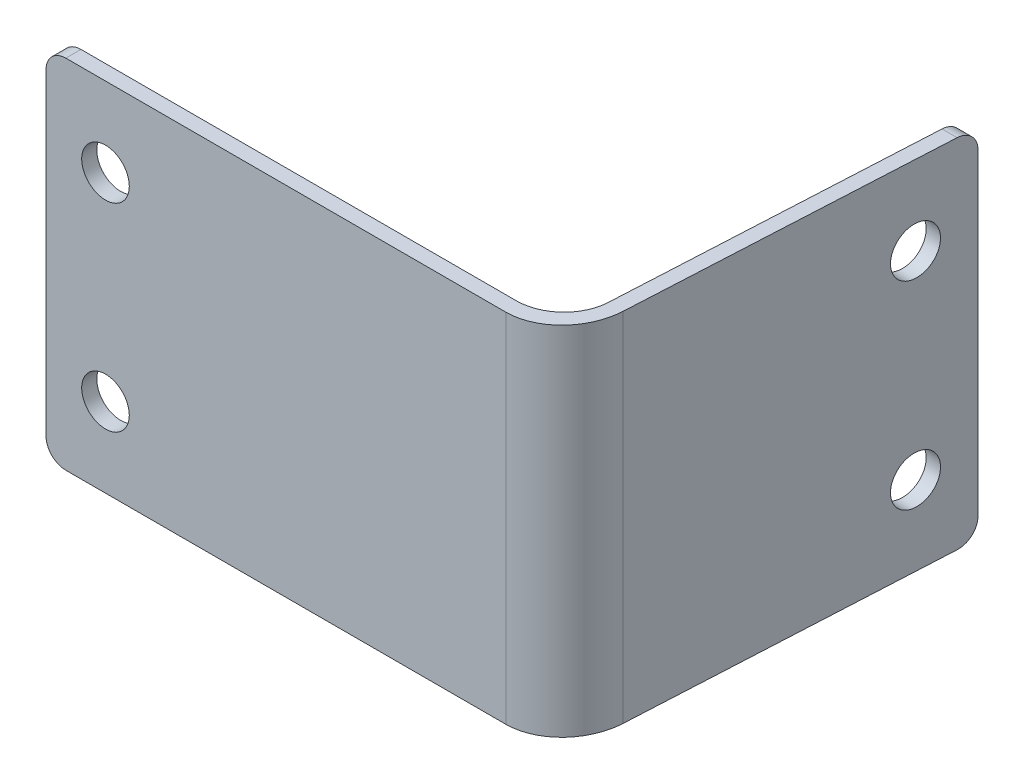
ISO-10303-21;
HEADER;
FILE_DESCRIPTION(('STEP AP214'),'2;1');
FILE_NAME('part.step','',(''),(''),'','','');
FILE_SCHEMA(('AUTOMOTIVE_DESIGN { 1 0 10303 214 1 1 1 1 }'));
ENDSEC;
DATA;
#1=APPLICATION_CONTEXT('core data for automotive mechanical design processes');
#2=APPLICATION_PROTOCOL_DEFINITION('international standard','automotive_design',2000,#1);
#3=PRODUCT_CONTEXT('',#1,'mechanical');
#4=PRODUCT('Part','Part','',(#3));
#5=PRODUCT_RELATED_PRODUCT_CATEGORY('part','',(#4));
#6=PRODUCT_DEFINITION_FORMATION('','',#4);
#7=PRODUCT_DEFINITION_CONTEXT('part definition',#1,'design');
#8=PRODUCT_DEFINITION('design','',#6,#7);
#9=PRODUCT_DEFINITION_SHAPE('','',#8);
#10=(LENGTH_UNIT() NAMED_UNIT(*) SI_UNIT(.MILLI.,.METRE.));
#11=(NAMED_UNIT(*) PLANE_ANGLE_UNIT() SI_UNIT($,.RADIAN.));
#12=(NAMED_UNIT(*) SI_UNIT($,.STERADIAN.) SOLID_ANGLE_UNIT());
#13=UNCERTAINTY_MEASURE_WITH_UNIT(LENGTH_MEASURE(1.E-05),#10,'distance_accuracy_value','');
#14=(GEOMETRIC_REPRESENTATION_CONTEXT(3) GLOBAL_UNCERTAINTY_ASSIGNED_CONTEXT((#13)) GLOBAL_UNIT_ASSIGNED_CONTEXT((#10,
#11,#12)) REPRESENTATION_CONTEXT('',''));
#15=CARTESIAN_POINT('',(0.,0.,0.));
#16=DIRECTION('',(0.,0.,1.));
#17=DIRECTION('',(1.,0.,0.));
#18=AXIS2_PLACEMENT_3D('',#15,#16,#17);
#19=CARTESIAN_POINT('',(155.924923679548,90.,104.096291682077));
#20=DIRECTION('',(0.,1.,0.));
#21=DIRECTION('',(0.,0.,1.));
#22=AXIS2_PLACEMENT_3D('',#19,#20,#21);
#23=ELLIPSE('',#22,15.903708317923,14.644076607642);
#24=DIRECTION('',(0.,-1.,0.));
#25=VECTOR('',#24,1.);
#26=SURFACE_OF_LINEAR_EXTRUSION('',#23,#25);
#27=CARTESIAN_POINT('',(155.924923679548,0.,104.096291682077));
#28=DIRECTION('',(0.,1.,0.));
#29=DIRECTION('',(0.,0.,1.));
#30=AXIS2_PLACEMENT_3D('',#27,#28,#29);
#31=ELLIPSE('',#30,15.903708317923,14.644076607642);
#32=CARTESIAN_POINT('',(155.924923679548,0.,120.));
#33=VERTEX_POINT('',#32);
#34=CARTESIAN_POINT('',(170.545338760942,0.,105.));
#35=VERTEX_POINT('',#34);
#36=EDGE_CURVE('E153',#33,#35,#31,.T.);
#37=ORIENTED_EDGE('',*,*,#36,.T.);
#38=DIRECTION('',(0.,-1.,0.));
#39=VECTOR('',#38,1.);
#40=CARTESIAN_POINT('',(170.545338760942,90.,105.));
#41=LINE('',#40,#39);
#42=CARTESIAN_POINT('',(170.545338760942,90.,105.));
#43=VERTEX_POINT('',#42);
#44=EDGE_CURVE('E132',#43,#35,#41,.T.);
#45=ORIENTED_EDGE('',*,*,#44,.F.);
#46=CARTESIAN_POINT('',(155.924923679548,90.,120.));
#47=VERTEX_POINT('',#46);
#48=EDGE_CURVE('E139',#47,#43,#23,.T.);
#49=ORIENTED_EDGE('',*,*,#48,.F.);
#50=DIRECTION('',(0.,-1.,0.));
#51=VECTOR('',#50,1.);
#52=CARTESIAN_POINT('',(155.924923679548,90.,120.));
#53=LINE('',#52,#51);
#54=EDGE_CURVE('E326',#47,#33,#53,.T.);
#55=ORIENTED_EDGE('',*,*,#54,.T.);
#56=EDGE_LOOP('',(#37,#45,#49,#55));
#57=FACE_BOUND('',#56,.T.);
#58=ADVANCED_FACE('F40',(#57),#26,.F.);
#59=CARTESIAN_POINT('',(175.,90.,20.));
#60=DIRECTION('',(-0.998629534754574,0.,-0.0523359562429405));
#61=DIRECTION('',(-0.0523359562429405,0.,0.998629534754574));
#62=AXIS2_PLACEMENT_3D('',#59,#60,#61);
#63=PLANE('',#62);
#64=CARTESIAN_POINT('',(174.214960656356,70.,34.979443021319));
#65=DIRECTION('',(0.998629534754574,0.,0.0523359562429405));
#66=DIRECTION('',(0.0523359562429405,0.,-0.998629534754574));
#67=AXIS2_PLACEMENT_3D('',#64,#65,#66);
#68=CIRCLE('',#67,6.00000000000001);
#69=CARTESIAN_POINT('',(174.528976393814,70.,28.9876658127916));
#70=VERTEX_POINT('',#69);
#71=EDGE_CURVE('E167',#70,#70,#68,.T.);
#72=ORIENTED_EDGE('',*,*,#71,.F.);
#73=EDGE_LOOP('',(#72));
#74=FACE_BOUND('',#73,.T.);
#75=CARTESIAN_POINT('',(174.214960656356,20.,34.979443021319));
#76=DIRECTION('',(0.998629534754574,0.,0.0523359562429405));
#77=DIRECTION('',(-0.0523359562429405,0.,0.998629534754574));
#78=AXIS2_PLACEMENT_3D('',#75,#76,#77);
#79=CIRCLE('',#78,5.99999999999999);
#80=CARTESIAN_POINT('',(173.900944918898,20.,40.9712202298464));
#81=VERTEX_POINT('',#80);
#82=EDGE_CURVE('E260',#81,#81,#79,.T.);
#83=ORIENTED_EDGE('',*,*,#82,.F.);
#84=EDGE_LOOP('',(#83));
#85=FACE_BOUND('',#84,.T.);
#86=DIRECTION('',(0.0523359562429405,0.,-0.998629534754574));
#87=VECTOR('',#86,1.);
#88=CARTESIAN_POINT('',(175.,0.,20.));
#89=LINE('',#88,#87);
#90=CARTESIAN_POINT('',(174.737961103585,0.,25.));
#91=VERTEX_POINT('',#90);
#92=EDGE_CURVE('E212',#35,#91,#89,.T.);
#93=ORIENTED_EDGE('',*,*,#92,.T.);
#94=CARTESIAN_POINT('',(174.737961103585,5.,25.));
#95=DIRECTION('',(-0.998629534754574,0.,-0.0523359562429405));
#96=DIRECTION('',(0.0523359562429405,0.,-0.998629534754574));
#97=AXIS2_PLACEMENT_3D('',#94,#95,#96);
#98=ELLIPSE('',#97,5.0068617299896,5.);
#99=CARTESIAN_POINT('',(175.,5.00000000000003,20.));
#100=VERTEX_POINT('',#99);
#101=EDGE_CURVE('E12',#91,#100,#98,.F.);
#102=ORIENTED_EDGE('',*,*,#101,.T.);
#103=DIRECTION('',(0.,-1.,0.));
#104=VECTOR('',#103,1.);
#105=CARTESIAN_POINT('',(175.,90.,20.));
#106=LINE('',#105,#104);
#107=CARTESIAN_POINT('',(175.,85.,20.));
#108=VERTEX_POINT('',#107);
#109=EDGE_CURVE('E155',#108,#100,#106,.T.);
#110=ORIENTED_EDGE('',*,*,#109,.F.);
#111=CARTESIAN_POINT('',(174.737961103585,85.,25.));
#112=DIRECTION('',(-0.998629534754574,0.,-0.0523359562429405));
#113=DIRECTION('',(-0.0523359562429405,0.,0.998629534754574));
#114=AXIS2_PLACEMENT_3D('',#111,#112,#113);
#115=ELLIPSE('',#114,5.0068617299896,5.);
#116=CARTESIAN_POINT('',(174.737961103585,90.,25.));
#117=VERTEX_POINT('',#116);
#118=EDGE_CURVE('E48',#108,#117,#115,.F.);
#119=ORIENTED_EDGE('',*,*,#118,.T.);
#120=DIRECTION('',(0.0523359562429405,0.,-0.998629534754574));
#121=VECTOR('',#120,1.);
#122=CARTESIAN_POINT('',(175.,90.,20.));
#123=LINE('',#122,#121);
#124=EDGE_CURVE('E128',#43,#117,#123,.T.);
#125=ORIENTED_EDGE('',*,*,#124,.F.);
#126=ORIENTED_EDGE('',*,*,#44,.T.);
#127=EDGE_LOOP('',(#93,#102,#110,#119,#125,#126));
#128=FACE_BOUND('',#127,.T.);
#129=ADVANCED_FACE('F130',(#74,#85,#128),#63,.F.);
#130=CARTESIAN_POINT('',(171.19,90.,20.));
#131=DIRECTION('',(0.,0.,1.));
#132=DIRECTION('',(1.,0.,0.));
#133=AXIS2_PLACEMENT_3D('',#130,#131,#132);
#134=PLANE('',#133);
#135=ORIENTED_EDGE('',*,*,#109,.T.);
#136=DIRECTION('',(-1.,0.,0.));
#137=VECTOR('',#136,1.);
#138=CARTESIAN_POINT('',(171.19,5.,20.));
#139=LINE('',#138,#137);
#140=CARTESIAN_POINT('',(171.19,5.00000000000003,20.));
#141=VERTEX_POINT('',#140);
#142=EDGE_CURVE('E190',#100,#141,#139,.T.);
#143=ORIENTED_EDGE('',*,*,#142,.T.);
#144=DIRECTION('',(0.,-1.,0.));
#145=VECTOR('',#144,1.);
#146=CARTESIAN_POINT('',(171.19,90.,20.));
#147=LINE('',#146,#145);
#148=CARTESIAN_POINT('',(171.19,85.,20.));
#149=VERTEX_POINT('',#148);
#150=EDGE_CURVE('E159',#149,#141,#147,.T.);
#151=ORIENTED_EDGE('',*,*,#150,.F.);
#152=DIRECTION('',(-1.,0.,0.));
#153=VECTOR('',#152,1.);
#154=CARTESIAN_POINT('',(171.19,85.,20.));
#155=LINE('',#154,#153);
#156=EDGE_CURVE('E60',#149,#108,#155,.F.);
#157=ORIENTED_EDGE('',*,*,#156,.T.);
#158=EDGE_LOOP('',(#135,#143,#151,#157));
#159=FACE_BOUND('',#158,.T.);
#160=ADVANCED_FACE('F215',(#159),#134,.F.);
#161=CARTESIAN_POINT('',(171.19,90.,20.));
#162=DIRECTION('',(0.998629534754574,0.,0.0523359562429405));
#163=DIRECTION('',(0.0523359562429405,0.,-0.998629534754574));
#164=AXIS2_PLACEMENT_3D('',#161,#162,#163);
#165=PLANE('',#164);
#166=CARTESIAN_POINT('',(170.415396445679,70.,34.7803162987941));
#167=DIRECTION('',(0.998629534754574,0.,0.0523359562429405));
#168=DIRECTION('',(0.0523359562429405,0.,-0.998629534754574));
#169=AXIS2_PLACEMENT_3D('',#166,#167,#168);
#170=CIRCLE('',#169,6.00000000000001);
#171=CARTESIAN_POINT('',(170.729412183137,70.,28.7885390902667));
#172=VERTEX_POINT('',#171);
#173=EDGE_CURVE('E166',#172,#172,#170,.T.);
#174=ORIENTED_EDGE('',*,*,#173,.T.);
#175=EDGE_LOOP('',(#174));
#176=FACE_BOUND('',#175,.T.);
#177=CARTESIAN_POINT('',(170.415396445679,20.,34.7803162987941));
#178=DIRECTION('',(0.998629534754574,0.,0.0523359562429405));
#179=DIRECTION('',(0.0523359562429405,0.,-0.998629534754574));
#180=AXIS2_PLACEMENT_3D('',#177,#178,#179);
#181=CIRCLE('',#180,5.99999999999999);
#182=CARTESIAN_POINT('',(170.729412183137,20.,28.7885390902667));
#183=VERTEX_POINT('',#182);
#184=EDGE_CURVE('E163',#183,#183,#181,.T.);
#185=ORIENTED_EDGE('',*,*,#184,.T.);
#186=EDGE_LOOP('',(#185));
#187=FACE_BOUND('',#186,.T.);
#188=ORIENTED_EDGE('',*,*,#150,.T.);
#189=CARTESIAN_POINT('',(170.927961103585,5.,25.));
#190=DIRECTION('',(0.998629534754574,0.,0.0523359562429405));
#191=DIRECTION('',(0.0523359562429405,0.,-0.998629534754574));
#192=AXIS2_PLACEMENT_3D('',#189,#190,#191);
#193=ELLIPSE('',#192,5.0068617299896,5.);
#194=CARTESIAN_POINT('',(170.927961103585,0.,25.));
#195=VERTEX_POINT('',#194);
#196=EDGE_CURVE('E195',#141,#195,#193,.F.);
#197=ORIENTED_EDGE('',*,*,#196,.T.);
#198=DIRECTION('',(-0.0523359562429405,0.,0.998629534754574));
#199=VECTOR('',#198,1.);
#200=CARTESIAN_POINT('',(171.19,0.,20.));
#201=LINE('',#200,#199);
#202=CARTESIAN_POINT('',(166.735338760942,0.,105.));
#203=VERTEX_POINT('',#202);
#204=EDGE_CURVE('E201',#195,#203,#201,.T.);
#205=ORIENTED_EDGE('',*,*,#204,.T.);
#206=DIRECTION('',(0.,-1.,0.));
#207=VECTOR('',#206,1.);
#208=CARTESIAN_POINT('',(166.735338760942,90.,105.));
#209=LINE('',#208,#207);
#210=CARTESIAN_POINT('',(166.735338760942,90.,105.));
#211=VERTEX_POINT('',#210);
#212=EDGE_CURVE('E218',#211,#203,#209,.T.);
#213=ORIENTED_EDGE('',*,*,#212,.F.);
#214=DIRECTION('',(-0.0523359562429405,0.,0.998629534754574));
#215=VECTOR('',#214,1.);
#216=CARTESIAN_POINT('',(171.19,90.,20.));
#217=LINE('',#216,#215);
#218=CARTESIAN_POINT('',(170.927961103585,90.,25.));
#219=VERTEX_POINT('',#218);
#220=EDGE_CURVE('E138',#219,#211,#217,.T.);
#221=ORIENTED_EDGE('',*,*,#220,.F.);
#222=CARTESIAN_POINT('',(170.927961103585,85.,25.));
#223=DIRECTION('',(0.998629534754574,0.,0.0523359562429405));
#224=DIRECTION('',(-0.0523359562429405,0.,0.998629534754574));
#225=AXIS2_PLACEMENT_3D('',#222,#223,#224);
#226=ELLIPSE('',#225,5.0068617299896,5.);
#227=EDGE_CURVE('E193',#219,#149,#226,.F.);
#228=ORIENTED_EDGE('',*,*,#227,.T.);
#229=EDGE_LOOP('',(#188,#197,#205,#213,#221,#228));
#230=FACE_BOUND('',#229,.T.);
#231=ADVANCED_FACE('F199',(#176,#187,#230),#165,.F.);
#232=CARTESIAN_POINT('',(154.751233709055,90.,104.393010375527));
#233=DIRECTION('',(0.,-1.,0.));
#234=DIRECTION('',(-1.,0.,0.));
#235=AXIS2_PLACEMENT_3D('',#232,#233,#234);
#236=ELLIPSE('',#235,12.,11.7969896244727);
#237=DIRECTION('',(0.,-1.,0.));
#238=VECTOR('',#237,1.);
#239=SURFACE_OF_LINEAR_EXTRUSION('',#236,#238);
#240=CARTESIAN_POINT('',(154.751233709055,0.,104.393010375527));
#241=DIRECTION('',(0.,-1.,0.));
#242=DIRECTION('',(-1.,0.,0.));
#243=AXIS2_PLACEMENT_3D('',#240,#241,#242);
#244=ELLIPSE('',#243,12.,11.7969896244727);
#245=CARTESIAN_POINT('',(154.751233709055,0.,116.19));
#246=VERTEX_POINT('',#245);
#247=EDGE_CURVE('E211',#203,#246,#244,.T.);
#248=ORIENTED_EDGE('',*,*,#247,.T.);
#249=DIRECTION('',(0.,-1.,0.));
#250=VECTOR('',#249,1.);
#251=CARTESIAN_POINT('',(154.751233709055,90.,116.19));
#252=LINE('',#251,#250);
#253=CARTESIAN_POINT('',(154.751233709055,90.,116.19));
#254=VERTEX_POINT('',#253);
#255=EDGE_CURVE('E313',#254,#246,#252,.T.);
#256=ORIENTED_EDGE('',*,*,#255,.F.);
#257=EDGE_CURVE('E220',#211,#254,#236,.T.);
#258=ORIENTED_EDGE('',*,*,#257,.F.);
#259=ORIENTED_EDGE('',*,*,#212,.T.);
#260=EDGE_LOOP('',(#248,#256,#258,#259));
#261=FACE_BOUND('',#260,.T.);
#262=ADVANCED_FACE('F228',(#261),#239,.F.);
#263=CARTESIAN_POINT('',(154.751233709055,90.,116.19));
#264=DIRECTION('',(0.,0.,1.));
#265=DIRECTION('',(1.,0.,0.));
#266=AXIS2_PLACEMENT_3D('',#263,#264,#265);
#267=PLANE('',#266);
#268=CARTESIAN_POINT('',(55.,70.,116.19));
#269=DIRECTION('',(0.,0.,1.));
#270=DIRECTION('',(1.,0.,0.));
#271=AXIS2_PLACEMENT_3D('',#268,#269,#270);
#272=CIRCLE('',#271,6.00000000000001);
#273=CARTESIAN_POINT('',(61.,70.,116.19));
#274=VERTEX_POINT('',#273);
#275=EDGE_CURVE('E249',#274,#274,#272,.T.);
#276=ORIENTED_EDGE('',*,*,#275,.T.);
#277=EDGE_LOOP('',(#276));
#278=FACE_BOUND('',#277,.T.);
#279=CARTESIAN_POINT('',(55.,20.,116.19));
#280=DIRECTION('',(0.,0.,1.));
#281=DIRECTION('',(1.,0.,0.));
#282=AXIS2_PLACEMENT_3D('',#279,#280,#281);
#283=CIRCLE('',#282,6.);
#284=CARTESIAN_POINT('',(61.,20.,116.19));
#285=VERTEX_POINT('',#284);
#286=EDGE_CURVE('E252',#285,#285,#283,.T.);
#287=ORIENTED_EDGE('',*,*,#286,.T.);
#288=EDGE_LOOP('',(#287));
#289=FACE_BOUND('',#288,.T.);
#290=DIRECTION('',(-1.,0.,0.));
#291=VECTOR('',#290,1.);
#292=CARTESIAN_POINT('',(154.751233709055,0.,116.19));
#293=LINE('',#292,#291);
#294=CARTESIAN_POINT('',(45.,0.,116.19));
#295=VERTEX_POINT('',#294);
#296=EDGE_CURVE('E321',#246,#295,#293,.T.);
#297=ORIENTED_EDGE('',*,*,#296,.T.);
#298=CARTESIAN_POINT('',(45.,5.,116.19));
#299=DIRECTION('',(0.,0.,1.));
#300=DIRECTION('',(1.,0.,0.));
#301=AXIS2_PLACEMENT_3D('',#298,#299,#300);
#302=CIRCLE('',#301,5.);
#303=CARTESIAN_POINT('',(40.,5.00000000000003,116.19));
#304=VERTEX_POINT('',#303);
#305=EDGE_CURVE('E183',#295,#304,#302,.F.);
#306=ORIENTED_EDGE('',*,*,#305,.T.);
#307=DIRECTION('',(0.,-1.,0.));
#308=VECTOR('',#307,1.);
#309=CARTESIAN_POINT('',(40.,90.,116.19));
#310=LINE('',#309,#308);
#311=CARTESIAN_POINT('',(40.,85.,116.19));
#312=VERTEX_POINT('',#311);
#313=EDGE_CURVE('E306',#312,#304,#310,.T.);
#314=ORIENTED_EDGE('',*,*,#313,.F.);
#315=CARTESIAN_POINT('',(45.,85.,116.19));
#316=DIRECTION('',(0.,0.,1.));
#317=DIRECTION('',(1.,0.,0.));
#318=AXIS2_PLACEMENT_3D('',#315,#316,#317);
#319=CIRCLE('',#318,5.);
#320=CARTESIAN_POINT('',(45.,90.,116.19));
#321=VERTEX_POINT('',#320);
#322=EDGE_CURVE('E181',#312,#321,#319,.F.);
#323=ORIENTED_EDGE('',*,*,#322,.T.);
#324=DIRECTION('',(-1.,0.,0.));
#325=VECTOR('',#324,1.);
#326=CARTESIAN_POINT('',(154.751233709055,90.,116.19));
#327=LINE('',#326,#325);
#328=EDGE_CURVE('E222',#254,#321,#327,.T.);
#329=ORIENTED_EDGE('',*,*,#328,.F.);
#330=ORIENTED_EDGE('',*,*,#255,.T.);
#331=EDGE_LOOP('',(#297,#306,#314,#323,#329,#330));
#332=FACE_BOUND('',#331,.T.);
#333=ADVANCED_FACE('F232',(#278,#289,#332),#267,.F.);
#334=CARTESIAN_POINT('',(40.,90.,116.19));
#335=DIRECTION('',(1.,0.,0.));
#336=DIRECTION('',(0.,0.,-1.));
#337=AXIS2_PLACEMENT_3D('',#334,#335,#336);
#338=PLANE('',#337);
#339=ORIENTED_EDGE('',*,*,#313,.T.);
#340=DIRECTION('',(0.,0.,1.));
#341=VECTOR('',#340,1.);
#342=CARTESIAN_POINT('',(40.,5.,120.));
#343=LINE('',#342,#341);
#344=CARTESIAN_POINT('',(40.,5.00000000000003,120.));
#345=VERTEX_POINT('',#344);
#346=EDGE_CURVE('E157',#304,#345,#343,.T.);
#347=ORIENTED_EDGE('',*,*,#346,.T.);
#348=DIRECTION('',(0.,-1.,0.));
#349=VECTOR('',#348,1.);
#350=CARTESIAN_POINT('',(40.,90.,120.));
#351=LINE('',#350,#349);
#352=CARTESIAN_POINT('',(40.,85.,120.));
#353=VERTEX_POINT('',#352);
#354=EDGE_CURVE('E314',#353,#345,#351,.T.);
#355=ORIENTED_EDGE('',*,*,#354,.F.);
#356=DIRECTION('',(0.,0.,1.));
#357=VECTOR('',#356,1.);
#358=CARTESIAN_POINT('',(40.,85.,116.19));
#359=LINE('',#358,#357);
#360=EDGE_CURVE('E154',#353,#312,#359,.F.);
#361=ORIENTED_EDGE('',*,*,#360,.T.);
#362=EDGE_LOOP('',(#339,#347,#355,#361));
#363=FACE_BOUND('',#362,.T.);
#364=ADVANCED_FACE('F296',(#363),#338,.F.);
#365=CARTESIAN_POINT('',(155.924923679548,90.,120.));
#366=DIRECTION('',(0.,0.,-1.));
#367=DIRECTION('',(-1.,0.,0.));
#368=AXIS2_PLACEMENT_3D('',#365,#366,#367);
#369=PLANE('',#368);
#370=CARTESIAN_POINT('',(55.,70.,120.));
#371=DIRECTION('',(0.,0.,1.));
#372=DIRECTION('',(1.,0.,0.));
#373=AXIS2_PLACEMENT_3D('',#370,#371,#372);
#374=CIRCLE('',#373,6.00000000000001);
#375=CARTESIAN_POINT('',(61.,70.,120.));
#376=VERTEX_POINT('',#375);
#377=EDGE_CURVE('E255',#376,#376,#374,.T.);
#378=ORIENTED_EDGE('',*,*,#377,.F.);
#379=EDGE_LOOP('',(#378));
#380=FACE_BOUND('',#379,.T.);
#381=CARTESIAN_POINT('',(55.,20.,120.));
#382=DIRECTION('',(0.,0.,1.));
#383=DIRECTION('',(-1.,0.,0.));
#384=AXIS2_PLACEMENT_3D('',#381,#382,#383);
#385=CIRCLE('',#384,6.);
#386=CARTESIAN_POINT('',(61.,20.,120.));
#387=VERTEX_POINT('',#386);
#388=EDGE_CURVE('E169',#387,#387,#385,.T.);
#389=ORIENTED_EDGE('',*,*,#388,.F.);
#390=EDGE_LOOP('',(#389));
#391=FACE_BOUND('',#390,.T.);
#392=ORIENTED_EDGE('',*,*,#354,.T.);
#393=CARTESIAN_POINT('',(45.,5.,120.));
#394=DIRECTION('',(0.,0.,-1.));
#395=DIRECTION('',(-1.,0.,0.));
#396=AXIS2_PLACEMENT_3D('',#393,#394,#395);
#397=CIRCLE('',#396,5.);
#398=CARTESIAN_POINT('',(45.,0.,120.));
#399=VERTEX_POINT('',#398);
#400=EDGE_CURVE('E175',#345,#399,#397,.F.);
#401=ORIENTED_EDGE('',*,*,#400,.T.);
#402=DIRECTION('',(1.,0.,0.));
#403=VECTOR('',#402,1.);
#404=CARTESIAN_POINT('',(155.924923679548,0.,120.));
#405=LINE('',#404,#403);
#406=EDGE_CURVE('E150',#399,#33,#405,.T.);
#407=ORIENTED_EDGE('',*,*,#406,.T.);
#408=ORIENTED_EDGE('',*,*,#54,.F.);
#409=DIRECTION('',(1.,0.,0.));
#410=VECTOR('',#409,1.);
#411=CARTESIAN_POINT('',(155.924923679548,90.,120.));
#412=LINE('',#411,#410);
#413=CARTESIAN_POINT('',(45.,90.,120.));
#414=VERTEX_POINT('',#413);
#415=EDGE_CURVE('E146',#414,#47,#412,.T.);
#416=ORIENTED_EDGE('',*,*,#415,.F.);
#417=CARTESIAN_POINT('',(45.,85.,120.));
#418=DIRECTION('',(0.,0.,-1.));
#419=DIRECTION('',(-1.,0.,0.));
#420=AXIS2_PLACEMENT_3D('',#417,#418,#419);
#421=CIRCLE('',#420,5.);
#422=EDGE_CURVE('E173',#414,#353,#421,.F.);
#423=ORIENTED_EDGE('',*,*,#422,.T.);
#424=EDGE_LOOP('',(#392,#401,#407,#408,#416,#423));
#425=FACE_BOUND('',#424,.T.);
#426=ADVANCED_FACE('F292',(#380,#391,#425),#369,.F.);
#427=CARTESIAN_POINT('',(155.924923679548,90.,104.096291682077));
#428=DIRECTION('',(0.,-1.,0.));
#429=DIRECTION('',(0.,0.,-1.));
#430=AXIS2_PLACEMENT_3D('',#427,#428,#429);
#431=PLANE('',#430);
#432=ORIENTED_EDGE('',*,*,#328,.T.);
#433=DIRECTION('',(0.,0.,1.));
#434=VECTOR('',#433,1.);
#435=CARTESIAN_POINT('',(45.,90.,104.096291682077));
#436=LINE('',#435,#434);
#437=EDGE_CURVE('E186',#321,#414,#436,.T.);
#438=ORIENTED_EDGE('',*,*,#437,.T.);
#439=ORIENTED_EDGE('',*,*,#415,.T.);
#440=ORIENTED_EDGE('',*,*,#48,.T.);
#441=ORIENTED_EDGE('',*,*,#124,.T.);
#442=DIRECTION('',(-1.,0.,0.));
#443=VECTOR('',#442,1.);
#444=CARTESIAN_POINT('',(155.924923679548,90.,25.));
#445=LINE('',#444,#443);
#446=EDGE_CURVE('E185',#117,#219,#445,.T.);
#447=ORIENTED_EDGE('',*,*,#446,.T.);
#448=ORIENTED_EDGE('',*,*,#220,.T.);
#449=ORIENTED_EDGE('',*,*,#257,.T.);
#450=EDGE_LOOP('',(#432,#438,#439,#440,#441,#447,#448,#449));
#451=FACE_BOUND('',#450,.T.);
#452=ADVANCED_FACE('F143',(#451),#431,.F.);
#453=CARTESIAN_POINT('',(155.924923679548,0.,104.096291682077));
#454=DIRECTION('',(0.,-1.,0.));
#455=DIRECTION('',(0.,0.,-1.));
#456=AXIS2_PLACEMENT_3D('',#453,#454,#455);
#457=PLANE('',#456);
#458=ORIENTED_EDGE('',*,*,#406,.F.);
#459=DIRECTION('',(0.,0.,1.));
#460=VECTOR('',#459,1.);
#461=CARTESIAN_POINT('',(45.,0.,116.19));
#462=LINE('',#461,#460);
#463=EDGE_CURVE('E179',#399,#295,#462,.F.);
#464=ORIENTED_EDGE('',*,*,#463,.T.);
#465=ORIENTED_EDGE('',*,*,#296,.F.);
#466=ORIENTED_EDGE('',*,*,#247,.F.);
#467=ORIENTED_EDGE('',*,*,#204,.F.);
#468=DIRECTION('',(-1.,0.,0.));
#469=VECTOR('',#468,1.);
#470=CARTESIAN_POINT('',(175.,0.,25.));
#471=LINE('',#470,#469);
#472=EDGE_CURVE('E177',#195,#91,#471,.F.);
#473=ORIENTED_EDGE('',*,*,#472,.T.);
#474=ORIENTED_EDGE('',*,*,#92,.F.);
#475=ORIENTED_EDGE('',*,*,#36,.F.);
#476=EDGE_LOOP('',(#458,#464,#465,#466,#467,#473,#474,#475));
#477=FACE_BOUND('',#476,.T.);
#478=ADVANCED_FACE('F209',(#477),#457,.T.);
#479=CARTESIAN_POINT('',(55.,20.,20.));
#480=DIRECTION('',(0.,0.,1.));
#481=DIRECTION('',(1.,0.,0.));
#482=AXIS2_PLACEMENT_3D('',#479,#480,#481);
#483=CYLINDRICAL_SURFACE('',#482,6.);
#484=CARTESIAN_POINT('',(61.,20.,120.));
#485=CARTESIAN_POINT('',(61.,20.,119.9603125));
#486=CARTESIAN_POINT('',(61.,20.,119.920625));
#487=CARTESIAN_POINT('',(61.,20.,119.84125));
#488=CARTESIAN_POINT('',(61.,20.,119.8015625));
#489=CARTESIAN_POINT('',(61.,20.,119.7221875));
#490=CARTESIAN_POINT('',(61.,20.,119.6825));
#491=CARTESIAN_POINT('',(61.,20.,119.603125));
#492=CARTESIAN_POINT('',(61.,20.,119.5634375));
#493=CARTESIAN_POINT('',(61.,20.,119.4840625));
#494=CARTESIAN_POINT('',(61.,20.,119.444375));
#495=CARTESIAN_POINT('',(61.,20.,119.365));
#496=CARTESIAN_POINT('',(61.,20.,119.3253125));
#497=CARTESIAN_POINT('',(61.,20.,119.2459375));
#498=CARTESIAN_POINT('',(61.,20.,119.20625));
#499=CARTESIAN_POINT('',(61.,20.,119.126875));
#500=CARTESIAN_POINT('',(61.,20.,119.0871875));
#501=CARTESIAN_POINT('',(61.,20.,119.0078125));
#502=CARTESIAN_POINT('',(61.,20.,118.968125));
#503=CARTESIAN_POINT('',(61.,20.,118.88875));
#504=CARTESIAN_POINT('',(61.,20.,118.8490625));
#505=CARTESIAN_POINT('',(61.,20.,118.7696875));
#506=CARTESIAN_POINT('',(61.,20.,118.73));
#507=CARTESIAN_POINT('',(61.,20.,118.650625));
#508=CARTESIAN_POINT('',(61.,20.,118.6109375));
#509=CARTESIAN_POINT('',(61.,20.,118.5315625));
#510=CARTESIAN_POINT('',(61.,20.,118.491875));
#511=CARTESIAN_POINT('',(61.,20.,118.4125));
#512=CARTESIAN_POINT('',(61.,20.,118.3728125));
#513=CARTESIAN_POINT('',(61.,20.,118.2934375));
#514=CARTESIAN_POINT('',(61.,20.,118.25375));
#515=CARTESIAN_POINT('',(61.,20.,118.174375));
#516=CARTESIAN_POINT('',(61.,20.,118.1346875));
#517=CARTESIAN_POINT('',(61.,20.,118.0553125));
#518=CARTESIAN_POINT('',(61.,20.,118.015625));
#519=CARTESIAN_POINT('',(61.,20.,117.93625));
#520=CARTESIAN_POINT('',(61.,20.,117.8965625));
#521=CARTESIAN_POINT('',(61.,20.,117.8171875));
#522=CARTESIAN_POINT('',(61.,20.,117.7775));
#523=CARTESIAN_POINT('',(61.,20.,117.698125));
#524=CARTESIAN_POINT('',(61.,20.,117.6584375));
#525=CARTESIAN_POINT('',(61.,20.,117.5790625));
#526=CARTESIAN_POINT('',(61.,20.,117.539375));
#527=CARTESIAN_POINT('',(61.,20.,117.46));
#528=CARTESIAN_POINT('',(61.,20.,117.4203125));
#529=CARTESIAN_POINT('',(61.,20.,117.3409375));
#530=CARTESIAN_POINT('',(61.,20.,117.30125));
#531=CARTESIAN_POINT('',(61.,20.,117.221875));
#532=CARTESIAN_POINT('',(61.,20.,117.1821875));
#533=CARTESIAN_POINT('',(61.,20.,117.1028125));
#534=CARTESIAN_POINT('',(61.,20.,117.063125));
#535=CARTESIAN_POINT('',(61.,20.,116.98375));
#536=CARTESIAN_POINT('',(61.,20.,116.9440625));
#537=CARTESIAN_POINT('',(61.,20.,116.8646875));
#538=CARTESIAN_POINT('',(61.,20.,116.825));
#539=CARTESIAN_POINT('',(61.,20.,116.745625));
#540=CARTESIAN_POINT('',(61.,20.,116.7059375));
#541=CARTESIAN_POINT('',(61.,20.,116.6265625));
#542=CARTESIAN_POINT('',(61.,20.,116.586875));
#543=CARTESIAN_POINT('',(61.,20.,116.5075));
#544=CARTESIAN_POINT('',(61.,20.,116.4678125));
#545=CARTESIAN_POINT('',(61.,20.,116.3884375));
#546=CARTESIAN_POINT('',(61.,20.,116.34875));
#547=CARTESIAN_POINT('',(61.,20.,116.269375));
#548=CARTESIAN_POINT('',(61.,20.,116.2296875));
#549=CARTESIAN_POINT('',(61.,20.,116.19));
#550=B_SPLINE_CURVE_WITH_KNOTS('',3,(#484,#485,#486,#487,#488,#489,#490,#491,#492,#493,#494,
#495,#496,#497,#498,#499,#500,#501,#502,#503,#504,#505,#506,#507,#508,#509,#510,#511,#512,#513,
#514,#515,#516,#517,#518,#519,#520,#521,#522,#523,#524,#525,#526,#527,#528,#529,#530,#531,#532,
#533,#534,#535,#536,#537,#538,#539,#540,#541,#542,#543,#544,#545,#546,#547,#548,#549),
.UNSPECIFIED.,.F.,.F.,(4,2,2,2,2,2,2,2,2,2,2,2,2,2,2,2,2,2,2,2,2,2,2,2,2,2,2,2,2,2,2,2,4),(0.,
0.119062500000003,0.238125000000006,0.357187499999995,0.476249999999998,0.5953125,
0.714375000000003,0.833437500000006,0.952499999999995,1.0715625,1.190625,1.3096875,
1.42875000000001,1.54781250000001,1.666875,1.7859375,1.905,2.02406250000001,2.14312500000001,
2.2621875,2.38125,2.5003125,2.61937500000001,2.73843750000001,2.85750000000001,2.9765625,
3.095625,3.21468750000001,3.33375000000001,3.45281250000001,3.571875,3.6909375,
3.81000000000001),.UNSPECIFIED.);
#551=EDGE_CURVE('BSEAM283',#387,#285,#550,.T.);
#552=ORIENTED_EDGE('',*,*,#388,.T.);
#553=ORIENTED_EDGE('',*,*,#286,.F.);
#554=ORIENTED_EDGE('',*,*,#551,.T.);
#555=ORIENTED_EDGE('',*,*,#551,.F.);
#556=EDGE_LOOP('',(#552,#554,#553,#555));
#557=FACE_BOUND('',#556,.T.);
#558=ADVANCED_FACE('F283',(#557),#483,.F.);
#559=CARTESIAN_POINT('',(55.,70.,20.));
#560=DIRECTION('',(0.,0.,1.));
#561=DIRECTION('',(1.,0.,0.));
#562=AXIS2_PLACEMENT_3D('',#559,#560,#561);
#563=CYLINDRICAL_SURFACE('',#562,6.00000000000001);
#564=CARTESIAN_POINT('',(61.,70.,120.));
#565=CARTESIAN_POINT('',(61.,70.,119.9603125));
#566=CARTESIAN_POINT('',(61.,70.,119.920625));
#567=CARTESIAN_POINT('',(61.,70.,119.84125));
#568=CARTESIAN_POINT('',(61.,70.,119.8015625));
#569=CARTESIAN_POINT('',(61.,70.,119.7221875));
#570=CARTESIAN_POINT('',(61.,70.,119.6825));
#571=CARTESIAN_POINT('',(61.,70.,119.603125));
#572=CARTESIAN_POINT('',(61.,70.,119.5634375));
#573=CARTESIAN_POINT('',(61.,70.,119.4840625));
#574=CARTESIAN_POINT('',(61.,70.,119.444375));
#575=CARTESIAN_POINT('',(61.,70.,119.365));
#576=CARTESIAN_POINT('',(61.,70.,119.3253125));
#577=CARTESIAN_POINT('',(61.,70.,119.2459375));
#578=CARTESIAN_POINT('',(61.,70.,119.20625));
#579=CARTESIAN_POINT('',(61.,70.,119.126875));
#580=CARTESIAN_POINT('',(61.,70.,119.0871875));
#581=CARTESIAN_POINT('',(61.,70.,119.0078125));
#582=CARTESIAN_POINT('',(61.,70.,118.968125));
#583=CARTESIAN_POINT('',(61.,70.,118.88875));
#584=CARTESIAN_POINT('',(61.,70.,118.8490625));
#585=CARTESIAN_POINT('',(61.,70.,118.7696875));
#586=CARTESIAN_POINT('',(61.,70.,118.73));
#587=CARTESIAN_POINT('',(61.,70.,118.650625));
#588=CARTESIAN_POINT('',(61.,70.,118.6109375));
#589=CARTESIAN_POINT('',(61.,70.,118.5315625));
#590=CARTESIAN_POINT('',(61.,70.,118.491875));
#591=CARTESIAN_POINT('',(61.,70.,118.4125));
#592=CARTESIAN_POINT('',(61.,70.,118.3728125));
#593=CARTESIAN_POINT('',(61.,70.,118.2934375));
#594=CARTESIAN_POINT('',(61.,70.,118.25375));
#595=CARTESIAN_POINT('',(61.,70.,118.174375));
#596=CARTESIAN_POINT('',(61.,70.,118.1346875));
#597=CARTESIAN_POINT('',(61.,70.,118.0553125));
#598=CARTESIAN_POINT('',(61.,70.,118.015625));
#599=CARTESIAN_POINT('',(61.,70.,117.93625));
#600=CARTESIAN_POINT('',(61.,70.,117.8965625));
#601=CARTESIAN_POINT('',(61.,70.,117.8171875));
#602=CARTESIAN_POINT('',(61.,70.,117.7775));
#603=CARTESIAN_POINT('',(61.,70.,117.698125));
#604=CARTESIAN_POINT('',(61.,70.,117.6584375));
#605=CARTESIAN_POINT('',(61.,70.,117.5790625));
#606=CARTESIAN_POINT('',(61.,70.,117.539375));
#607=CARTESIAN_POINT('',(61.,70.,117.46));
#608=CARTESIAN_POINT('',(61.,70.,117.4203125));
#609=CARTESIAN_POINT('',(61.,70.,117.3409375));
#610=CARTESIAN_POINT('',(61.,70.,117.30125));
#611=CARTESIAN_POINT('',(61.,70.,117.221875));
#612=CARTESIAN_POINT('',(61.,70.,117.1821875));
#613=CARTESIAN_POINT('',(61.,70.,117.1028125));
#614=CARTESIAN_POINT('',(61.,70.,117.063125));
#615=CARTESIAN_POINT('',(61.,70.,116.98375));
#616=CARTESIAN_POINT('',(61.,70.,116.9440625));
#617=CARTESIAN_POINT('',(61.,70.,116.8646875));
#618=CARTESIAN_POINT('',(61.,70.,116.825));
#619=CARTESIAN_POINT('',(61.,70.,116.745625));
#620=CARTESIAN_POINT('',(61.,70.,116.7059375));
#621=CARTESIAN_POINT('',(61.,70.,116.6265625));
#622=CARTESIAN_POINT('',(61.,70.,116.586875));
#623=CARTESIAN_POINT('',(61.,70.,116.5075));
#624=CARTESIAN_POINT('',(61.,70.,116.4678125));
#625=CARTESIAN_POINT('',(61.,70.,116.3884375));
#626=CARTESIAN_POINT('',(61.,70.,116.34875));
#627=CARTESIAN_POINT('',(61.,70.,116.269375));
#628=CARTESIAN_POINT('',(61.,70.,116.2296875));
#629=CARTESIAN_POINT('',(61.,70.,116.19));
#630=B_SPLINE_CURVE_WITH_KNOTS('',3,(#564,#565,#566,#567,#568,#569,#570,#571,#572,#573,#574,
#575,#576,#577,#578,#579,#580,#581,#582,#583,#584,#585,#586,#587,#588,#589,#590,#591,#592,#593,
#594,#595,#596,#597,#598,#599,#600,#601,#602,#603,#604,#605,#606,#607,#608,#609,#610,#611,#612,
#613,#614,#615,#616,#617,#618,#619,#620,#621,#622,#623,#624,#625,#626,#627,#628,#629),
.UNSPECIFIED.,.F.,.F.,(4,2,2,2,2,2,2,2,2,2,2,2,2,2,2,2,2,2,2,2,2,2,2,2,2,2,2,2,2,2,2,2,4),(0.,
0.119062500000003,0.238125000000006,0.357187499999995,0.476249999999998,0.5953125,
0.714375000000003,0.833437500000006,0.952499999999995,1.0715625,1.190625,1.3096875,
1.42875000000001,1.54781250000001,1.666875,1.7859375,1.905,2.02406250000001,2.14312500000001,
2.2621875,2.38125,2.5003125,2.61937500000001,2.73843750000001,2.85750000000001,2.9765625,
3.095625,3.21468750000001,3.33375000000001,3.45281250000001,3.571875,3.6909375,
3.81000000000001),.UNSPECIFIED.);
#631=EDGE_CURVE('BSEAM274',#376,#274,#630,.T.);
#632=ORIENTED_EDGE('',*,*,#377,.T.);
#633=ORIENTED_EDGE('',*,*,#275,.F.);
#634=ORIENTED_EDGE('',*,*,#631,.T.);
#635=ORIENTED_EDGE('',*,*,#631,.F.);
#636=EDGE_LOOP('',(#632,#634,#633,#635));
#637=FACE_BOUND('',#636,.T.);
#638=ADVANCED_FACE('F274',(#637),#563,.F.);
#639=CARTESIAN_POINT('',(39.5847327189973,20.,27.9237717507528));
#640=DIRECTION('',(0.998629534754574,0.,0.0523359562429405));
#641=DIRECTION('',(0.0523359562429405,0.,-0.998629534754574));
#642=AXIS2_PLACEMENT_3D('',#639,#640,#641);
#643=CYLINDRICAL_SURFACE('',#642,5.99999999999999);
#644=ORIENTED_EDGE('',*,*,#82,.T.);
#645=EDGE_LOOP('',(#644));
#646=FACE_BOUND('',#645,.T.);
#647=ORIENTED_EDGE('',*,*,#184,.F.);
#648=EDGE_LOOP('',(#647));
#649=FACE_BOUND('',#648,.T.);
#650=ADVANCED_FACE('F271',(#646,#649),#643,.F.);
#651=CARTESIAN_POINT('',(39.5847327189973,70.,27.9237717507528));
#652=DIRECTION('',(0.998629534754574,0.,0.0523359562429405));
#653=DIRECTION('',(0.0523359562429405,0.,-0.998629534754574));
#654=AXIS2_PLACEMENT_3D('',#651,#652,#653);
#655=CYLINDRICAL_SURFACE('',#654,6.00000000000001);
#656=ORIENTED_EDGE('',*,*,#71,.T.);
#657=EDGE_LOOP('',(#656));
#658=FACE_BOUND('',#657,.T.);
#659=ORIENTED_EDGE('',*,*,#173,.F.);
#660=EDGE_LOOP('',(#659));
#661=FACE_BOUND('',#660,.T.);
#662=ADVANCED_FACE('F266',(#658,#661),#655,.F.);
#663=CARTESIAN_POINT('',(45.,5.,116.19));
#664=DIRECTION('',(0.,0.,-1.));
#665=DIRECTION('',(-1.,0.,0.));
#666=AXIS2_PLACEMENT_3D('',#663,#664,#665);
#667=CYLINDRICAL_SURFACE('',#666,5.);
#668=ORIENTED_EDGE('',*,*,#305,.F.);
#669=ORIENTED_EDGE('',*,*,#463,.F.);
#670=ORIENTED_EDGE('',*,*,#400,.F.);
#671=ORIENTED_EDGE('',*,*,#346,.F.);
#672=EDGE_LOOP('',(#668,#669,#670,#671));
#673=FACE_BOUND('',#672,.T.);
#674=ADVANCED_FACE('F245',(#673),#667,.T.);
#675=CARTESIAN_POINT('',(45.,85.,104.096291682077));
#676=DIRECTION('',(0.,0.,1.));
#677=DIRECTION('',(1.,0.,0.));
#678=AXIS2_PLACEMENT_3D('',#675,#676,#677);
#679=CYLINDRICAL_SURFACE('',#678,5.);
#680=ORIENTED_EDGE('',*,*,#322,.F.);
#681=ORIENTED_EDGE('',*,*,#360,.F.);
#682=ORIENTED_EDGE('',*,*,#422,.F.);
#683=ORIENTED_EDGE('',*,*,#437,.F.);
#684=EDGE_LOOP('',(#680,#681,#682,#683));
#685=FACE_BOUND('',#684,.T.);
#686=ADVANCED_FACE('F335',(#685),#679,.T.);
#687=CARTESIAN_POINT('',(171.19,5.,25.));
#688=DIRECTION('',(1.,0.,0.));
#689=DIRECTION('',(0.,0.,-1.));
#690=AXIS2_PLACEMENT_3D('',#687,#688,#689);
#691=CYLINDRICAL_SURFACE('',#690,5.);
#692=ORIENTED_EDGE('',*,*,#101,.F.);
#693=ORIENTED_EDGE('',*,*,#472,.F.);
#694=ORIENTED_EDGE('',*,*,#196,.F.);
#695=ORIENTED_EDGE('',*,*,#142,.F.);
#696=EDGE_LOOP('',(#692,#693,#694,#695));
#697=FACE_BOUND('',#696,.T.);
#698=ADVANCED_FACE('F214',(#697),#691,.T.);
#699=CARTESIAN_POINT('',(155.924923679548,85.,25.));
#700=DIRECTION('',(-1.,0.,0.));
#701=DIRECTION('',(0.,0.,1.));
#702=AXIS2_PLACEMENT_3D('',#699,#700,#701);
#703=CYLINDRICAL_SURFACE('',#702,5.);
#704=ORIENTED_EDGE('',*,*,#118,.F.);
#705=ORIENTED_EDGE('',*,*,#156,.F.);
#706=ORIENTED_EDGE('',*,*,#227,.F.);
#707=ORIENTED_EDGE('',*,*,#446,.F.);
#708=EDGE_LOOP('',(#704,#705,#706,#707));
#709=FACE_BOUND('',#708,.T.);
#710=ADVANCED_FACE('F42',(#709),#703,.T.);
#711=CLOSED_SHELL('',(#58,#129,#160,#231,#262,#333,#364,#426,#452,#478,#558,#638,#650,#662,#674,
#686,#698,#710));
#712=MANIFOLD_SOLID_BREP('B2',#711);
#713=ADVANCED_BREP_SHAPE_REPRESENTATION('',(#18,#712),#14);
#714=SHAPE_DEFINITION_REPRESENTATION(#9,#713);
ENDSEC;
END-ISO-10303-21;
